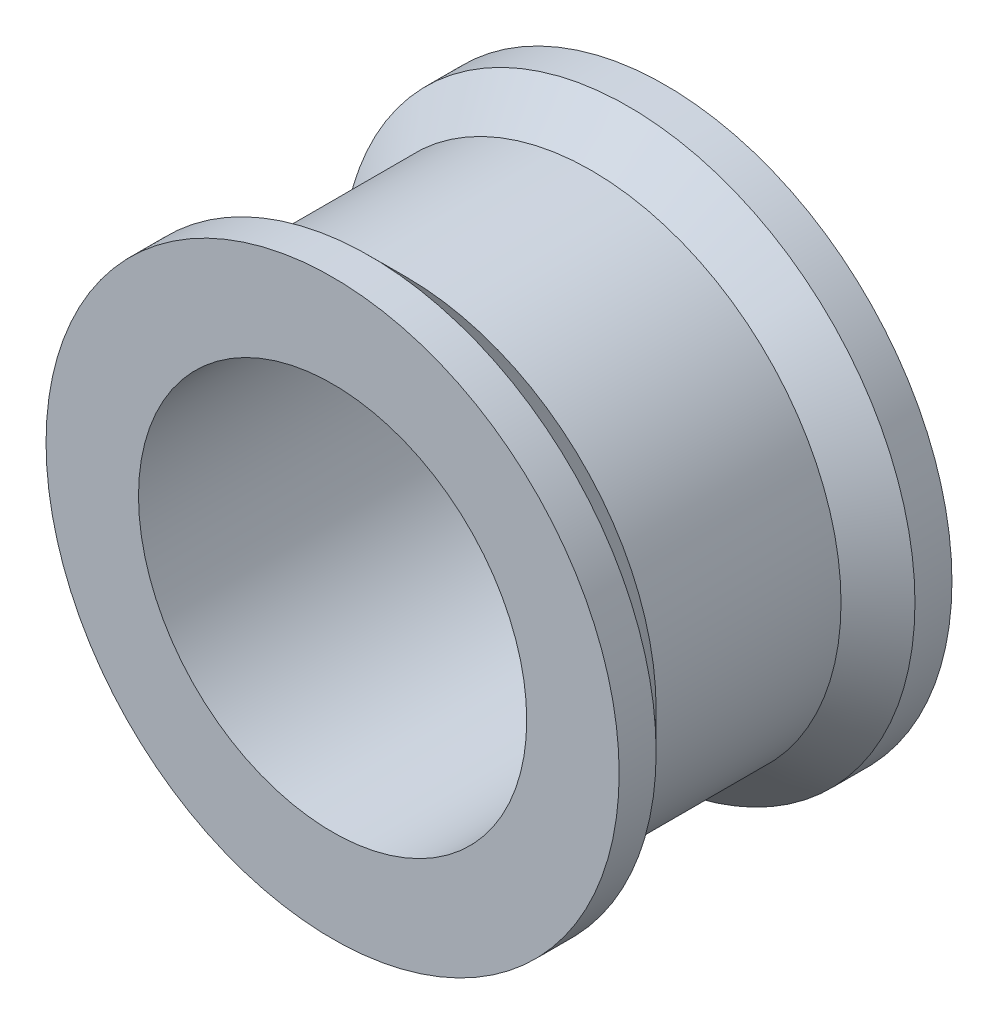
ISO-10303-21;
HEADER;
FILE_DESCRIPTION(('STEP AP214'),'2;1');
FILE_NAME('part.step','',(''),(''),'','','');
FILE_SCHEMA(('AUTOMOTIVE_DESIGN { 1 0 10303 214 1 1 1 1 }'));
ENDSEC;
DATA;
#1=APPLICATION_CONTEXT('core data for automotive mechanical design processes');
#2=APPLICATION_PROTOCOL_DEFINITION('international standard','automotive_design',2000,#1);
#3=PRODUCT_CONTEXT('',#1,'mechanical');
#4=PRODUCT('Part','Part','',(#3));
#5=PRODUCT_RELATED_PRODUCT_CATEGORY('part','',(#4));
#6=PRODUCT_DEFINITION_FORMATION('','',#4);
#7=PRODUCT_DEFINITION_CONTEXT('part definition',#1,'design');
#8=PRODUCT_DEFINITION('design','',#6,#7);
#9=PRODUCT_DEFINITION_SHAPE('','',#8);
#10=(LENGTH_UNIT() NAMED_UNIT(*) SI_UNIT(.MILLI.,.METRE.));
#11=(NAMED_UNIT(*) PLANE_ANGLE_UNIT() SI_UNIT($,.RADIAN.));
#12=(NAMED_UNIT(*) SI_UNIT($,.STERADIAN.) SOLID_ANGLE_UNIT());
#13=UNCERTAINTY_MEASURE_WITH_UNIT(LENGTH_MEASURE(1.E-05),#10,'distance_accuracy_value','');
#14=(GEOMETRIC_REPRESENTATION_CONTEXT(3) GLOBAL_UNCERTAINTY_ASSIGNED_CONTEXT((#13)) GLOBAL_UNIT_ASSIGNED_CONTEXT((#10,
#11,#12)) REPRESENTATION_CONTEXT('',''));
#15=CARTESIAN_POINT('',(0.,0.,0.));
#16=DIRECTION('',(0.,0.,1.));
#17=DIRECTION('',(1.,0.,0.));
#18=AXIS2_PLACEMENT_3D('',#15,#16,#17);
#19=CARTESIAN_POINT('',(0.,0.,0.));
#20=DIRECTION('',(0.,0.,1.));
#21=DIRECTION('',(1.,0.,0.));
#22=AXIS2_PLACEMENT_3D('',#19,#20,#21);
#23=PLANE('',#22);
#24=CARTESIAN_POINT('',(0.,0.,0.));
#25=DIRECTION('',(0.,0.,1.));
#26=DIRECTION('',(1.,0.,0.));
#27=AXIS2_PLACEMENT_3D('',#24,#25,#26);
#28=CIRCLE('',#27,7.75);
#29=CARTESIAN_POINT('',(7.75,0.,0.));
#30=VERTEX_POINT('',#29);
#31=EDGE_CURVE('E42',#30,#30,#28,.T.);
#32=ORIENTED_EDGE('',*,*,#31,.F.);
#33=EDGE_LOOP('',(#32));
#34=FACE_BOUND('',#33,.T.);
#35=CARTESIAN_POINT('',(0.,0.,0.));
#36=DIRECTION('',(0.,0.,1.));
#37=DIRECTION('',(1.,0.,0.));
#38=AXIS2_PLACEMENT_3D('',#35,#36,#37);
#39=CIRCLE('',#38,5.25);
#40=CARTESIAN_POINT('',(5.25,0.,0.));
#41=VERTEX_POINT('',#40);
#42=EDGE_CURVE('E47',#41,#41,#39,.T.);
#43=ORIENTED_EDGE('',*,*,#42,.T.);
#44=EDGE_LOOP('',(#43));
#45=FACE_BOUND('',#44,.T.);
#46=ADVANCED_FACE('F31',(#34,#45),#23,.F.);
#47=CARTESIAN_POINT('',(0.,0.,1.));
#48=DIRECTION('',(0.,0.,-1.));
#49=DIRECTION('',(-1.,0.,0.));
#50=AXIS2_PLACEMENT_3D('',#47,#48,#49);
#51=CYLINDRICAL_SURFACE('',#50,7.75);
#52=CARTESIAN_POINT('',(0.,0.,1.));
#53=DIRECTION('',(0.,0.,1.));
#54=DIRECTION('',(1.,0.,0.));
#55=AXIS2_PLACEMENT_3D('',#52,#53,#54);
#56=CIRCLE('',#55,7.75);
#57=CARTESIAN_POINT('',(7.75,0.,1.));
#58=VERTEX_POINT('',#57);
#59=EDGE_CURVE('E38',#58,#58,#56,.T.);
#60=ORIENTED_EDGE('',*,*,#59,.F.);
#61=EDGE_LOOP('',(#60));
#62=FACE_BOUND('',#61,.T.);
#63=ORIENTED_EDGE('',*,*,#31,.T.);
#64=EDGE_LOOP('',(#63));
#65=FACE_BOUND('',#64,.T.);
#66=ADVANCED_FACE('F80',(#62,#65),#51,.T.);
#67=CARTESIAN_POINT('',(0.,0.,1.));
#68=DIRECTION('',(0.,0.,-1.));
#69=DIRECTION('',(-1.,0.,0.));
#70=AXIS2_PLACEMENT_3D('',#67,#68,#69);
#71=CYLINDRICAL_SURFACE('',#70,5.25);
#72=ORIENTED_EDGE('',*,*,#42,.F.);
#73=EDGE_LOOP('',(#72));
#74=FACE_BOUND('',#73,.T.);
#75=CARTESIAN_POINT('',(0.,0.,9.));
#76=DIRECTION('',(0.,0.,1.));
#77=DIRECTION('',(1.,0.,0.));
#78=AXIS2_PLACEMENT_3D('',#75,#76,#77);
#79=CIRCLE('',#78,5.25);
#80=CARTESIAN_POINT('',(5.25,0.,9.));
#81=VERTEX_POINT('',#80);
#82=EDGE_CURVE('E58',#81,#81,#79,.T.);
#83=ORIENTED_EDGE('',*,*,#82,.T.);
#84=EDGE_LOOP('',(#83));
#85=FACE_BOUND('',#84,.T.);
#86=ADVANCED_FACE('F64',(#74,#85),#71,.F.);
#87=CARTESIAN_POINT('',(0.,0.,4.5));
#88=DIRECTION('',(0.,0.,-1.));
#89=DIRECTION('',(-1.,0.,0.));
#90=AXIS2_PLACEMENT_3D('',#87,#88,#89);
#91=CYLINDRICAL_SURFACE('',#90,6.75);
#92=CARTESIAN_POINT('',(0.,0.,2.00000000000001));
#93=DIRECTION('',(0.,0.,1.));
#94=DIRECTION('',(1.,0.,0.));
#95=AXIS2_PLACEMENT_3D('',#92,#93,#94);
#96=CIRCLE('',#95,6.75);
#97=CARTESIAN_POINT('',(6.75,0.,2.00000000000001));
#98=VERTEX_POINT('',#97);
#99=EDGE_CURVE('E10',#98,#98,#96,.T.);
#100=ORIENTED_EDGE('',*,*,#99,.T.);
#101=EDGE_LOOP('',(#100));
#102=FACE_BOUND('',#101,.T.);
#103=CARTESIAN_POINT('',(0.,0.,6.99999999999999));
#104=DIRECTION('',(0.,0.,1.));
#105=DIRECTION('',(1.,0.,0.));
#106=AXIS2_PLACEMENT_3D('',#103,#104,#105);
#107=CIRCLE('',#106,6.75);
#108=CARTESIAN_POINT('',(6.75,0.,6.99999999999999));
#109=VERTEX_POINT('',#108);
#110=EDGE_CURVE('E51',#109,#109,#107,.T.);
#111=ORIENTED_EDGE('',*,*,#110,.F.);
#112=EDGE_LOOP('',(#111));
#113=FACE_BOUND('',#112,.T.);
#114=ADVANCED_FACE('F78',(#102,#113),#91,.T.);
#115=CARTESIAN_POINT('',(0.,0.,2.00000000000001));
#116=DIRECTION('',(0.,0.,-1.));
#117=DIRECTION('',(-1.,0.,0.));
#118=AXIS2_PLACEMENT_3D('',#115,#116,#117);
#119=CONICAL_SURFACE('',#118,6.75,0.785398163397443);
#120=ORIENTED_EDGE('',*,*,#59,.T.);
#121=EDGE_LOOP('',(#120));
#122=FACE_BOUND('',#121,.T.);
#123=ORIENTED_EDGE('',*,*,#99,.F.);
#124=EDGE_LOOP('',(#123));
#125=FACE_BOUND('',#124,.T.);
#126=ADVANCED_FACE('F33',(#122,#125),#119,.T.);
#127=CARTESIAN_POINT('',(0.,0.,9.));
#128=DIRECTION('',(0.,0.,-1.));
#129=DIRECTION('',(1.,0.,0.));
#130=AXIS2_PLACEMENT_3D('',#127,#128,#129);
#131=PLANE('',#130);
#132=CARTESIAN_POINT('',(0.,0.,9.));
#133=DIRECTION('',(0.,0.,1.));
#134=DIRECTION('',(1.,0.,0.));
#135=AXIS2_PLACEMENT_3D('',#132,#133,#134);
#136=CIRCLE('',#135,7.75);
#137=CARTESIAN_POINT('',(7.75,0.,9.));
#138=VERTEX_POINT('',#137);
#139=EDGE_CURVE('E55',#138,#138,#136,.T.);
#140=ORIENTED_EDGE('',*,*,#139,.T.);
#141=EDGE_LOOP('',(#140));
#142=FACE_BOUND('',#141,.T.);
#143=ORIENTED_EDGE('',*,*,#82,.F.);
#144=EDGE_LOOP('',(#143));
#145=FACE_BOUND('',#144,.T.);
#146=ADVANCED_FACE('F66',(#142,#145),#131,.F.);
#147=CARTESIAN_POINT('',(0.,0.,8.));
#148=DIRECTION('',(0.,0.,1.));
#149=DIRECTION('',(-1.,0.,0.));
#150=AXIS2_PLACEMENT_3D('',#147,#148,#149);
#151=CYLINDRICAL_SURFACE('',#150,7.75);
#152=CARTESIAN_POINT('',(0.,0.,8.));
#153=DIRECTION('',(0.,0.,1.));
#154=DIRECTION('',(1.,0.,0.));
#155=AXIS2_PLACEMENT_3D('',#152,#153,#154);
#156=CIRCLE('',#155,7.75);
#157=CARTESIAN_POINT('',(7.75,0.,8.));
#158=VERTEX_POINT('',#157);
#159=EDGE_CURVE('E54',#158,#158,#156,.T.);
#160=ORIENTED_EDGE('',*,*,#159,.T.);
#161=EDGE_LOOP('',(#160));
#162=FACE_BOUND('',#161,.T.);
#163=ORIENTED_EDGE('',*,*,#139,.F.);
#164=EDGE_LOOP('',(#163));
#165=FACE_BOUND('',#164,.T.);
#166=ADVANCED_FACE('F68',(#162,#165),#151,.T.);
#167=CARTESIAN_POINT('',(0.,0.,6.99999999999999));
#168=DIRECTION('',(0.,0.,1.));
#169=DIRECTION('',(-1.,0.,0.));
#170=AXIS2_PLACEMENT_3D('',#167,#168,#169);
#171=CONICAL_SURFACE('',#170,6.75,0.785398163397443);
#172=ORIENTED_EDGE('',*,*,#159,.F.);
#173=EDGE_LOOP('',(#172));
#174=FACE_BOUND('',#173,.T.);
#175=ORIENTED_EDGE('',*,*,#110,.T.);
#176=EDGE_LOOP('',(#175));
#177=FACE_BOUND('',#176,.T.);
#178=ADVANCED_FACE('F75',(#174,#177),#171,.T.);
#179=CLOSED_SHELL('',(#46,#66,#86,#114,#126,#146,#166,#178));
#180=MANIFOLD_SOLID_BREP('B2',#179);
#181=ADVANCED_BREP_SHAPE_REPRESENTATION('',(#18,#180),#14);
#182=SHAPE_DEFINITION_REPRESENTATION(#9,#181);
ENDSEC;
END-ISO-10303-21;
